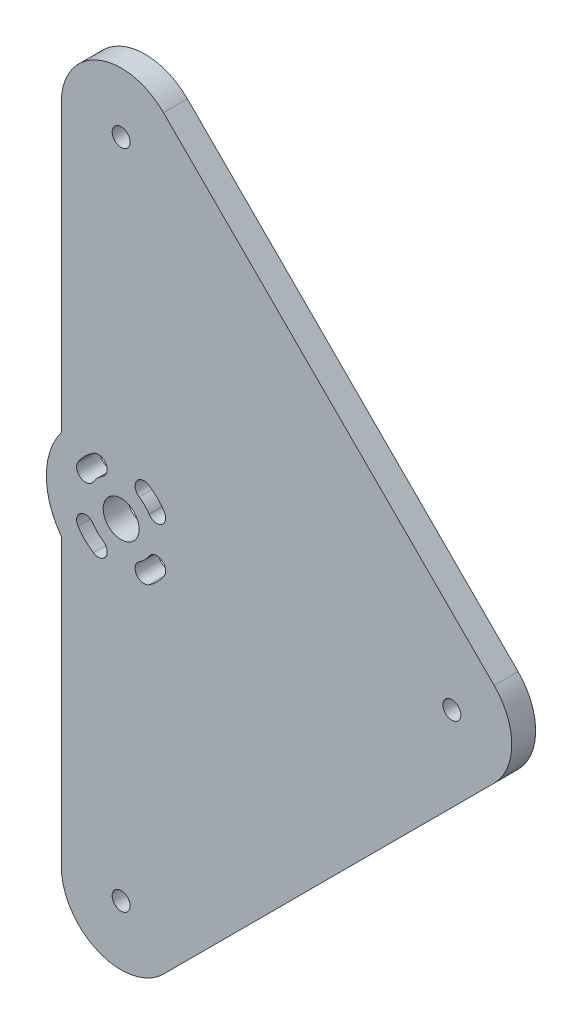
ISO-10303-21;
HEADER;
FILE_DESCRIPTION(('STEP AP214'),'2;1');
FILE_NAME('part.step','',(''),(''),'','','');
FILE_SCHEMA(('AUTOMOTIVE_DESIGN { 1 0 10303 214 1 1 1 1 }'));
ENDSEC;
DATA;
#1=APPLICATION_CONTEXT('core data for automotive mechanical design processes');
#2=APPLICATION_PROTOCOL_DEFINITION('international standard','automotive_design',2000,#1);
#3=PRODUCT_CONTEXT('',#1,'mechanical');
#4=PRODUCT('Part','Part','',(#3));
#5=PRODUCT_RELATED_PRODUCT_CATEGORY('part','',(#4));
#6=PRODUCT_DEFINITION_FORMATION('','',#4);
#7=PRODUCT_DEFINITION_CONTEXT('part definition',#1,'design');
#8=PRODUCT_DEFINITION('design','',#6,#7);
#9=PRODUCT_DEFINITION_SHAPE('','',#8);
#10=(LENGTH_UNIT() NAMED_UNIT(*) SI_UNIT(.MILLI.,.METRE.));
#11=(NAMED_UNIT(*) PLANE_ANGLE_UNIT() SI_UNIT($,.RADIAN.));
#12=(NAMED_UNIT(*) SI_UNIT($,.STERADIAN.) SOLID_ANGLE_UNIT());
#13=UNCERTAINTY_MEASURE_WITH_UNIT(LENGTH_MEASURE(1.E-05),#10,'distance_accuracy_value','');
#14=(GEOMETRIC_REPRESENTATION_CONTEXT(3) GLOBAL_UNCERTAINTY_ASSIGNED_CONTEXT((#13)) GLOBAL_UNIT_ASSIGNED_CONTEXT((#10,
#11,#12)) REPRESENTATION_CONTEXT('',''));
#15=CARTESIAN_POINT('',(0.,0.,0.));
#16=DIRECTION('',(0.,0.,1.));
#17=DIRECTION('',(1.,0.,0.));
#18=AXIS2_PLACEMENT_3D('',#15,#16,#17);
#19=CARTESIAN_POINT('',(1800.79736778428,1502.75717799725,4.));
#20=DIRECTION('',(0.,0.,1.));
#21=DIRECTION('',(1.,0.,0.));
#22=AXIS2_PLACEMENT_3D('',#19,#20,#21);
#23=PLANE('',#22);
#24=CARTESIAN_POINT('',(1856.05220178022,1558.01201199318,4.));
#25=DIRECTION('',(0.,0.,1.));
#26=DIRECTION('',(1.,0.,0.));
#27=AXIS2_PLACEMENT_3D('',#24,#25,#26);
#28=CIRCLE('',#27,1.50000000000006);
#29=CARTESIAN_POINT('',(1857.55220178022,1558.01201199318,4.));
#30=VERTEX_POINT('',#29);
#31=EDGE_CURVE('E331',#30,#30,#28,.T.);
#32=ORIENTED_EDGE('',*,*,#31,.F.);
#33=EDGE_LOOP('',(#32));
#34=FACE_BOUND('',#33,.T.);
#35=CARTESIAN_POINT('',(1800.79736778428,1558.01201199318,4.));
#36=DIRECTION('',(0.,0.,1.));
#37=DIRECTION('',(1.,0.,0.));
#38=AXIS2_PLACEMENT_3D('',#35,#36,#37);
#39=CIRCLE('',#38,2.99999999999989);
#40=CARTESIAN_POINT('',(1803.79736778428,1558.01201199318,4.));
#41=VERTEX_POINT('',#40);
#42=EDGE_CURVE('E343',#41,#41,#39,.T.);
#43=ORIENTED_EDGE('',*,*,#42,.F.);
#44=EDGE_LOOP('',(#43));
#45=FACE_BOUND('',#44,.T.);
#46=CARTESIAN_POINT('',(1800.79736778428,1502.75717799725,4.));
#47=DIRECTION('',(0.,0.,1.));
#48=DIRECTION('',(1.,0.,0.));
#49=AXIS2_PLACEMENT_3D('',#46,#47,#48);
#50=CIRCLE('',#49,10.);
#51=CARTESIAN_POINT('',(1790.79736778428,1502.75717799725,4.));
#52=VERTEX_POINT('',#51);
#53=CARTESIAN_POINT('',(1807.86843559615,1495.68611018538,4.));
#54=VERTEX_POINT('',#53);
#55=EDGE_CURVE('E349',#52,#54,#50,.T.);
#56=ORIENTED_EDGE('',*,*,#55,.T.);
#57=DIRECTION('',(0.70710678118655,0.707106781186545,0.));
#58=VECTOR('',#57,1.);
#59=CARTESIAN_POINT('',(1863.12326959209,1550.94094418132,4.));
#60=LINE('',#59,#58);
#61=CARTESIAN_POINT('',(1863.12326959209,1550.94094418132,4.));
#62=VERTEX_POINT('',#61);
#63=EDGE_CURVE('E352',#54,#62,#60,.T.);
#64=ORIENTED_EDGE('',*,*,#63,.T.);
#65=CARTESIAN_POINT('',(1856.05220178022,1558.01201199318,4.));
#66=DIRECTION('',(0.,0.,1.));
#67=DIRECTION('',(1.,0.,0.));
#68=AXIS2_PLACEMENT_3D('',#65,#66,#67);
#69=CIRCLE('',#68,10.);
#70=CARTESIAN_POINT('',(1863.12326959209,1565.08307980505,4.));
#71=VERTEX_POINT('',#70);
#72=EDGE_CURVE('E355',#62,#71,#69,.T.);
#73=ORIENTED_EDGE('',*,*,#72,.T.);
#74=DIRECTION('',(-0.707106781186546,0.707106781186549,0.));
#75=VECTOR('',#74,1.);
#76=CARTESIAN_POINT('',(1807.86843559615,1620.33791380099,4.));
#77=LINE('',#76,#75);
#78=CARTESIAN_POINT('',(1807.86843559615,1620.33791380099,4.));
#79=VERTEX_POINT('',#78);
#80=EDGE_CURVE('E357',#71,#79,#77,.T.);
#81=ORIENTED_EDGE('',*,*,#80,.T.);
#82=CARTESIAN_POINT('',(1800.79736778428,1613.26684598912,4.));
#83=DIRECTION('',(0.,0.,1.));
#84=DIRECTION('',(1.,0.,0.));
#85=AXIS2_PLACEMENT_3D('',#82,#83,#84);
#86=CIRCLE('',#85,10.0000000000001);
#87=CARTESIAN_POINT('',(1790.79736778428,1613.26684598912,4.));
#88=VERTEX_POINT('',#87);
#89=EDGE_CURVE('E359',#79,#88,#86,.T.);
#90=ORIENTED_EDGE('',*,*,#89,.T.);
#91=DIRECTION('',(0.,-1.,0.));
#92=VECTOR('',#91,1.);
#93=CARTESIAN_POINT('',(1790.79736778428,1613.26684598912,4.));
#94=LINE('',#93,#92);
#95=CARTESIAN_POINT('',(1790.79736778428,1565.51201199318,4.));
#96=VERTEX_POINT('',#95);
#97=EDGE_CURVE('E361',#88,#96,#94,.T.);
#98=ORIENTED_EDGE('',*,*,#97,.T.);
#99=CARTESIAN_POINT('',(1800.79736778428,1558.01201199318,4.));
#100=DIRECTION('',(0.,0.,1.));
#101=DIRECTION('',(1.,0.,0.));
#102=AXIS2_PLACEMENT_3D('',#99,#100,#101);
#103=CIRCLE('',#102,12.5);
#104=CARTESIAN_POINT('',(1790.79736778428,1550.51201199318,4.));
#105=VERTEX_POINT('',#104);
#106=EDGE_CURVE('E363',#96,#105,#103,.T.);
#107=ORIENTED_EDGE('',*,*,#106,.T.);
#108=DIRECTION('',(0.,-1.,0.));
#109=VECTOR('',#108,1.);
#110=CARTESIAN_POINT('',(1790.79736778428,1550.51201199318,4.));
#111=LINE('',#110,#109);
#112=EDGE_CURVE('E365',#105,#52,#111,.T.);
#113=ORIENTED_EDGE('',*,*,#112,.T.);
#114=EDGE_LOOP('',(#56,#64,#73,#81,#90,#98,#107,#113));
#115=FACE_BOUND('',#114,.T.);
#116=CARTESIAN_POINT('',(1800.79736778428,1613.26684598912,4.));
#117=DIRECTION('',(0.,0.,1.));
#118=DIRECTION('',(1.,0.,0.));
#119=AXIS2_PLACEMENT_3D('',#116,#117,#118);
#120=CIRCLE('',#119,1.50000000000006);
#121=CARTESIAN_POINT('',(1802.29736778428,1613.26684598912,4.));
#122=VERTEX_POINT('',#121);
#123=EDGE_CURVE('E337',#122,#122,#120,.T.);
#124=ORIENTED_EDGE('',*,*,#123,.F.);
#125=EDGE_LOOP('',(#124));
#126=FACE_BOUND('',#125,.T.);
#127=CARTESIAN_POINT('',(1800.79736778428,1502.75717799725,4.));
#128=DIRECTION('',(0.,0.,1.));
#129=DIRECTION('',(1.,0.,0.));
#130=AXIS2_PLACEMENT_3D('',#127,#128,#129);
#131=CIRCLE('',#130,1.50000000000006);
#132=CARTESIAN_POINT('',(1802.29736778428,1502.75717799725,4.));
#133=VERTEX_POINT('',#132);
#134=EDGE_CURVE('E325',#133,#133,#131,.T.);
#135=ORIENTED_EDGE('',*,*,#134,.F.);
#136=EDGE_LOOP('',(#135));
#137=FACE_BOUND('',#136,.T.);
#138=CARTESIAN_POINT('',(1800.79736778428,1558.01201199318,4.));
#139=DIRECTION('',(0.,0.,1.));
#140=DIRECTION('',(1.,0.,0.));
#141=AXIS2_PLACEMENT_3D('',#138,#139,#140);
#142=CIRCLE('',#141,8.57106781186541);
#143=CARTESIAN_POINT('',(1805.44325522365,1550.80930879672,4.));
#144=VERTEX_POINT('',#143);
#145=CARTESIAN_POINT('',(1808.00007098075,1553.36612455382,4.));
#146=VERTEX_POINT('',#145);
#147=EDGE_CURVE('E296',#144,#146,#142,.T.);
#148=ORIENTED_EDGE('',*,*,#147,.F.);
#149=CARTESIAN_POINT('',(1804.630190701,1552.0698349099,4.));
#150=DIRECTION('',(0.,0.,1.));
#151=DIRECTION('',(1.,0.,0.));
#152=AXIS2_PLACEMENT_3D('',#149,#150,#151);
#153=CIRCLE('',#152,1.49999999999997);
#154=CARTESIAN_POINT('',(1803.81712617835,1553.33036102308,4.));
#155=VERTEX_POINT('',#154);
#156=EDGE_CURVE('E294',#155,#144,#153,.T.);
#157=ORIENTED_EDGE('',*,*,#156,.F.);
#158=CARTESIAN_POINT('',(1800.79736778428,1558.01201199318,4.));
#159=DIRECTION('',(0.,0.,-1.));
#160=DIRECTION('',(1.,0.,0.));
#161=AXIS2_PLACEMENT_3D('',#158,#159,#160);
#162=CIRCLE('',#161,5.57106781186547);
#163=CARTESIAN_POINT('',(1805.47901875439,1554.99225359912,4.));
#164=VERTEX_POINT('',#163);
#165=EDGE_CURVE('E302',#164,#155,#162,.T.);
#166=ORIENTED_EDGE('',*,*,#165,.F.);
#167=CARTESIAN_POINT('',(1806.73954486757,1554.17918907647,4.));
#168=DIRECTION('',(0.,0.,1.));
#169=DIRECTION('',(1.,0.,0.));
#170=AXIS2_PLACEMENT_3D('',#167,#168,#169);
#171=CIRCLE('',#170,1.49999999999997);
#172=EDGE_CURVE('E299',#146,#164,#171,.T.);
#173=ORIENTED_EDGE('',*,*,#172,.F.);
#174=EDGE_LOOP('',(#148,#157,#166,#173));
#175=FACE_BOUND('',#174,.T.);
#176=CARTESIAN_POINT('',(1800.79736778428,1558.01201199318,4.));
#177=DIRECTION('',(0.,0.,1.));
#178=DIRECTION('',(1.,0.,0.));
#179=AXIS2_PLACEMENT_3D('',#176,#177,#178);
#180=CIRCLE('',#179,8.57106781186541);
#181=CARTESIAN_POINT('',(1808.00007098075,1562.65789943255,4.));
#182=VERTEX_POINT('',#181);
#183=CARTESIAN_POINT('',(1805.44325522365,1565.21471518965,4.));
#184=VERTEX_POINT('',#183);
#185=EDGE_CURVE('E265',#182,#184,#180,.T.);
#186=ORIENTED_EDGE('',*,*,#185,.F.);
#187=CARTESIAN_POINT('',(1806.73954486757,1561.8448349099,4.));
#188=DIRECTION('',(0.,0.,1.));
#189=DIRECTION('',(1.,0.,0.));
#190=AXIS2_PLACEMENT_3D('',#187,#188,#189);
#191=CIRCLE('',#190,1.49999999999997);
#192=CARTESIAN_POINT('',(1805.47901875439,1561.03177038725,4.));
#193=VERTEX_POINT('',#192);
#194=EDGE_CURVE('E263',#193,#182,#191,.T.);
#195=ORIENTED_EDGE('',*,*,#194,.F.);
#196=CARTESIAN_POINT('',(1800.79736778428,1558.01201199318,4.));
#197=DIRECTION('',(0.,0.,-1.));
#198=DIRECTION('',(1.,0.,0.));
#199=AXIS2_PLACEMENT_3D('',#196,#197,#198);
#200=CIRCLE('',#199,5.57106781186547);
#201=CARTESIAN_POINT('',(1803.81712617835,1562.69366296329,4.));
#202=VERTEX_POINT('',#201);
#203=EDGE_CURVE('E271',#202,#193,#200,.T.);
#204=ORIENTED_EDGE('',*,*,#203,.F.);
#205=CARTESIAN_POINT('',(1804.630190701,1563.95418907647,4.));
#206=DIRECTION('',(0.,0.,1.));
#207=DIRECTION('',(1.,0.,0.));
#208=AXIS2_PLACEMENT_3D('',#205,#206,#207);
#209=CIRCLE('',#208,1.49999999999997);
#210=EDGE_CURVE('E268',#184,#202,#209,.T.);
#211=ORIENTED_EDGE('',*,*,#210,.F.);
#212=EDGE_LOOP('',(#186,#195,#204,#211));
#213=FACE_BOUND('',#212,.T.);
#214=CARTESIAN_POINT('',(1800.79736778428,1558.01201199318,4.));
#215=DIRECTION('',(0.,0.,1.));
#216=DIRECTION('',(1.,0.,0.));
#217=AXIS2_PLACEMENT_3D('',#214,#215,#216);
#218=CIRCLE('',#217,8.57106781186556);
#219=CARTESIAN_POINT('',(1796.15148034492,1565.21471518965,4.));
#220=VERTEX_POINT('',#219);
#221=CARTESIAN_POINT('',(1793.59466458782,1562.65789943255,4.));
#222=VERTEX_POINT('',#221);
#223=EDGE_CURVE('E234',#220,#222,#218,.T.);
#224=ORIENTED_EDGE('',*,*,#223,.F.);
#225=CARTESIAN_POINT('',(1796.96454486757,1563.95418907647,4.));
#226=DIRECTION('',(0.,0.,1.));
#227=DIRECTION('',(1.,0.,0.));
#228=AXIS2_PLACEMENT_3D('',#225,#226,#227);
#229=CIRCLE('',#228,1.49999999999997);
#230=CARTESIAN_POINT('',(1797.77760939022,1562.69366296329,4.));
#231=VERTEX_POINT('',#230);
#232=EDGE_CURVE('E232',#231,#220,#229,.T.);
#233=ORIENTED_EDGE('',*,*,#232,.F.);
#234=CARTESIAN_POINT('',(1800.79736778428,1558.01201199318,4.));
#235=DIRECTION('',(0.,0.,-1.));
#236=DIRECTION('',(1.,0.,0.));
#237=AXIS2_PLACEMENT_3D('',#234,#235,#236);
#238=CIRCLE('',#237,5.57106781186563);
#239=CARTESIAN_POINT('',(1796.11571681418,1561.03177038725,4.));
#240=VERTEX_POINT('',#239);
#241=EDGE_CURVE('E240',#240,#231,#238,.T.);
#242=ORIENTED_EDGE('',*,*,#241,.F.);
#243=CARTESIAN_POINT('',(1794.855190701,1561.8448349099,4.));
#244=DIRECTION('',(0.,0.,1.));
#245=DIRECTION('',(1.,0.,0.));
#246=AXIS2_PLACEMENT_3D('',#243,#244,#245);
#247=CIRCLE('',#246,1.49999999999997);
#248=EDGE_CURVE('E237',#222,#240,#247,.T.);
#249=ORIENTED_EDGE('',*,*,#248,.F.);
#250=EDGE_LOOP('',(#224,#233,#242,#249));
#251=FACE_BOUND('',#250,.T.);
#252=CARTESIAN_POINT('',(1800.79736778428,1558.01201199318,4.));
#253=DIRECTION('',(0.,0.,1.));
#254=DIRECTION('',(1.,0.,0.));
#255=AXIS2_PLACEMENT_3D('',#252,#253,#254);
#256=CIRCLE('',#255,8.57106781186556);
#257=CARTESIAN_POINT('',(1793.59466458782,1553.36612455382,4.));
#258=VERTEX_POINT('',#257);
#259=CARTESIAN_POINT('',(1796.15148034492,1550.80930879672,4.));
#260=VERTEX_POINT('',#259);
#261=EDGE_CURVE('E204',#258,#260,#256,.T.);
#262=ORIENTED_EDGE('',*,*,#261,.F.);
#263=CARTESIAN_POINT('',(1794.855190701,1554.17918907647,4.));
#264=DIRECTION('',(0.,0.,1.));
#265=DIRECTION('',(1.,0.,0.));
#266=AXIS2_PLACEMENT_3D('',#263,#264,#265);
#267=CIRCLE('',#266,1.49999999999997);
#268=CARTESIAN_POINT('',(1796.11571681418,1554.99225359912,4.));
#269=VERTEX_POINT('',#268);
#270=EDGE_CURVE('E196',#269,#258,#267,.T.);
#271=ORIENTED_EDGE('',*,*,#270,.F.);
#272=CARTESIAN_POINT('',(1800.79736778428,1558.01201199318,4.));
#273=DIRECTION('',(0.,0.,-1.));
#274=DIRECTION('',(1.,0.,0.));
#275=AXIS2_PLACEMENT_3D('',#272,#273,#274);
#276=CIRCLE('',#275,5.57106781186563);
#277=CARTESIAN_POINT('',(1797.77760939022,1553.33036102308,4.));
#278=VERTEX_POINT('',#277);
#279=EDGE_CURVE('E218',#278,#269,#276,.T.);
#280=ORIENTED_EDGE('',*,*,#279,.F.);
#281=CARTESIAN_POINT('',(1796.96454486757,1552.0698349099,4.));
#282=DIRECTION('',(0.,0.,1.));
#283=DIRECTION('',(1.,0.,0.));
#284=AXIS2_PLACEMENT_3D('',#281,#282,#283);
#285=CIRCLE('',#284,1.49999999999997);
#286=EDGE_CURVE('E216',#260,#278,#285,.T.);
#287=ORIENTED_EDGE('',*,*,#286,.F.);
#288=EDGE_LOOP('',(#262,#271,#280,#287));
#289=FACE_BOUND('',#288,.T.);
#290=ADVANCED_FACE('F35',(#34,#45,#115,#126,#137,#175,#213,#251,#289),#23,.T.);
#291=CARTESIAN_POINT('',(1800.79736778428,1502.75717799725,0.));
#292=DIRECTION('',(0.,0.,1.));
#293=DIRECTION('',(1.,0.,0.));
#294=AXIS2_PLACEMENT_3D('',#291,#292,#293);
#295=PLANE('',#294);
#296=CARTESIAN_POINT('',(1796.96454486757,1563.95418907647,0.));
#297=DIRECTION('',(0.,0.,1.));
#298=DIRECTION('',(1.,0.,0.));
#299=AXIS2_PLACEMENT_3D('',#296,#297,#298);
#300=CIRCLE('',#299,1.49999999999997);
#301=CARTESIAN_POINT('',(1797.77760939022,1562.69366296329,0.));
#302=VERTEX_POINT('',#301);
#303=CARTESIAN_POINT('',(1796.15148034492,1565.21471518965,0.));
#304=VERTEX_POINT('',#303);
#305=EDGE_CURVE('E212',#302,#304,#300,.T.);
#306=ORIENTED_EDGE('',*,*,#305,.T.);
#307=CARTESIAN_POINT('',(1800.79736778428,1558.01201199318,0.));
#308=DIRECTION('',(0.,0.,1.));
#309=DIRECTION('',(1.,0.,0.));
#310=AXIS2_PLACEMENT_3D('',#307,#308,#309);
#311=CIRCLE('',#310,8.57106781186556);
#312=CARTESIAN_POINT('',(1793.59466458782,1562.65789943255,0.));
#313=VERTEX_POINT('',#312);
#314=EDGE_CURVE('E245',#304,#313,#311,.T.);
#315=ORIENTED_EDGE('',*,*,#314,.T.);
#316=CARTESIAN_POINT('',(1794.855190701,1561.8448349099,0.));
#317=DIRECTION('',(0.,0.,1.));
#318=DIRECTION('',(1.,0.,0.));
#319=AXIS2_PLACEMENT_3D('',#316,#317,#318);
#320=CIRCLE('',#319,1.49999999999997);
#321=CARTESIAN_POINT('',(1796.11571681418,1561.03177038725,0.));
#322=VERTEX_POINT('',#321);
#323=EDGE_CURVE('E248',#313,#322,#320,.T.);
#324=ORIENTED_EDGE('',*,*,#323,.T.);
#325=CARTESIAN_POINT('',(1800.79736778428,1558.01201199318,0.));
#326=DIRECTION('',(0.,0.,-1.));
#327=DIRECTION('',(1.,0.,0.));
#328=AXIS2_PLACEMENT_3D('',#325,#326,#327);
#329=CIRCLE('',#328,5.57106781186563);
#330=EDGE_CURVE('E235',#322,#302,#329,.T.);
#331=ORIENTED_EDGE('',*,*,#330,.T.);
#332=EDGE_LOOP('',(#306,#315,#324,#331));
#333=FACE_BOUND('',#332,.T.);
#334=CARTESIAN_POINT('',(1804.630190701,1552.0698349099,0.));
#335=DIRECTION('',(0.,0.,1.));
#336=DIRECTION('',(1.,0.,0.));
#337=AXIS2_PLACEMENT_3D('',#334,#335,#336);
#338=CIRCLE('',#337,1.49999999999997);
#339=CARTESIAN_POINT('',(1803.81712617835,1553.33036102308,0.));
#340=VERTEX_POINT('',#339);
#341=CARTESIAN_POINT('',(1805.44325522365,1550.80930879672,0.));
#342=VERTEX_POINT('',#341);
#343=EDGE_CURVE('E293',#340,#342,#338,.T.);
#344=ORIENTED_EDGE('',*,*,#343,.T.);
#345=CARTESIAN_POINT('',(1800.79736778428,1558.01201199318,0.));
#346=DIRECTION('',(0.,0.,1.));
#347=DIRECTION('',(1.,0.,0.));
#348=AXIS2_PLACEMENT_3D('',#345,#346,#347);
#349=CIRCLE('',#348,8.57106781186541);
#350=CARTESIAN_POINT('',(1808.00007098075,1553.36612455382,0.));
#351=VERTEX_POINT('',#350);
#352=EDGE_CURVE('E307',#342,#351,#349,.T.);
#353=ORIENTED_EDGE('',*,*,#352,.T.);
#354=CARTESIAN_POINT('',(1806.73954486757,1554.17918907647,0.));
#355=DIRECTION('',(0.,0.,1.));
#356=DIRECTION('',(1.,0.,0.));
#357=AXIS2_PLACEMENT_3D('',#354,#355,#356);
#358=CIRCLE('',#357,1.49999999999997);
#359=CARTESIAN_POINT('',(1805.47901875439,1554.99225359912,0.));
#360=VERTEX_POINT('',#359);
#361=EDGE_CURVE('E310',#351,#360,#358,.T.);
#362=ORIENTED_EDGE('',*,*,#361,.T.);
#363=CARTESIAN_POINT('',(1800.79736778428,1558.01201199318,0.));
#364=DIRECTION('',(0.,0.,-1.));
#365=DIRECTION('',(1.,0.,0.));
#366=AXIS2_PLACEMENT_3D('',#363,#364,#365);
#367=CIRCLE('',#366,5.57106781186547);
#368=EDGE_CURVE('E297',#360,#340,#367,.T.);
#369=ORIENTED_EDGE('',*,*,#368,.T.);
#370=EDGE_LOOP('',(#344,#353,#362,#369));
#371=FACE_BOUND('',#370,.T.);
#372=CARTESIAN_POINT('',(1800.79736778428,1502.75717799725,0.));
#373=DIRECTION('',(0.,0.,1.));
#374=DIRECTION('',(1.,0.,0.));
#375=AXIS2_PLACEMENT_3D('',#372,#373,#374);
#376=CIRCLE('',#375,10.);
#377=CARTESIAN_POINT('',(1790.79736778428,1502.75717799725,0.));
#378=VERTEX_POINT('',#377);
#379=CARTESIAN_POINT('',(1807.86843559615,1495.68611018538,0.));
#380=VERTEX_POINT('',#379);
#381=EDGE_CURVE('E346',#378,#380,#376,.T.);
#382=ORIENTED_EDGE('',*,*,#381,.F.);
#383=DIRECTION('',(0.,-1.,0.));
#384=VECTOR('',#383,1.);
#385=CARTESIAN_POINT('',(1790.79736778428,1550.51201199318,0.));
#386=LINE('',#385,#384);
#387=CARTESIAN_POINT('',(1790.79736778428,1550.51201199318,0.));
#388=VERTEX_POINT('',#387);
#389=EDGE_CURVE('E353',#388,#378,#386,.T.);
#390=ORIENTED_EDGE('',*,*,#389,.F.);
#391=CARTESIAN_POINT('',(1800.79736778428,1558.01201199318,0.));
#392=DIRECTION('',(0.,0.,1.));
#393=DIRECTION('',(1.,0.,0.));
#394=AXIS2_PLACEMENT_3D('',#391,#392,#393);
#395=CIRCLE('',#394,12.5);
#396=CARTESIAN_POINT('',(1790.79736778428,1565.51201199318,0.));
#397=VERTEX_POINT('',#396);
#398=EDGE_CURVE('E380',#397,#388,#395,.T.);
#399=ORIENTED_EDGE('',*,*,#398,.F.);
#400=DIRECTION('',(0.,-1.,0.));
#401=VECTOR('',#400,1.);
#402=CARTESIAN_POINT('',(1790.79736778428,1613.26684598912,0.));
#403=LINE('',#402,#401);
#404=CARTESIAN_POINT('',(1790.79736778428,1613.26684598912,0.));
#405=VERTEX_POINT('',#404);
#406=EDGE_CURVE('E378',#405,#397,#403,.T.);
#407=ORIENTED_EDGE('',*,*,#406,.F.);
#408=CARTESIAN_POINT('',(1800.79736778428,1613.26684598912,0.));
#409=DIRECTION('',(0.,0.,1.));
#410=DIRECTION('',(1.,0.,0.));
#411=AXIS2_PLACEMENT_3D('',#408,#409,#410);
#412=CIRCLE('',#411,10.0000000000001);
#413=CARTESIAN_POINT('',(1807.86843559615,1620.33791380099,0.));
#414=VERTEX_POINT('',#413);
#415=EDGE_CURVE('E376',#414,#405,#412,.T.);
#416=ORIENTED_EDGE('',*,*,#415,.F.);
#417=DIRECTION('',(-0.707106781186546,0.707106781186549,0.));
#418=VECTOR('',#417,1.);
#419=CARTESIAN_POINT('',(1807.86843559615,1620.33791380099,0.));
#420=LINE('',#419,#418);
#421=CARTESIAN_POINT('',(1863.12326959209,1565.08307980505,0.));
#422=VERTEX_POINT('',#421);
#423=EDGE_CURVE('E374',#422,#414,#420,.T.);
#424=ORIENTED_EDGE('',*,*,#423,.F.);
#425=CARTESIAN_POINT('',(1856.05220178022,1558.01201199318,0.));
#426=DIRECTION('',(0.,0.,1.));
#427=DIRECTION('',(1.,0.,0.));
#428=AXIS2_PLACEMENT_3D('',#425,#426,#427);
#429=CIRCLE('',#428,10.);
#430=CARTESIAN_POINT('',(1863.12326959209,1550.94094418132,0.));
#431=VERTEX_POINT('',#430);
#432=EDGE_CURVE('E372',#431,#422,#429,.T.);
#433=ORIENTED_EDGE('',*,*,#432,.F.);
#434=DIRECTION('',(0.70710678118655,0.707106781186545,0.));
#435=VECTOR('',#434,1.);
#436=CARTESIAN_POINT('',(1863.12326959209,1550.94094418132,0.));
#437=LINE('',#436,#435);
#438=EDGE_CURVE('E370',#380,#431,#437,.T.);
#439=ORIENTED_EDGE('',*,*,#438,.F.);
#440=EDGE_LOOP('',(#382,#390,#399,#407,#416,#424,#433,#439));
#441=FACE_BOUND('',#440,.T.);
#442=CARTESIAN_POINT('',(1800.79736778428,1558.01201199318,0.));
#443=DIRECTION('',(0.,0.,1.));
#444=DIRECTION('',(1.,0.,0.));
#445=AXIS2_PLACEMENT_3D('',#442,#443,#444);
#446=CIRCLE('',#445,2.99999999999989);
#447=CARTESIAN_POINT('',(1803.79736778428,1558.01201199318,0.));
#448=VERTEX_POINT('',#447);
#449=EDGE_CURVE('E340',#448,#448,#446,.T.);
#450=ORIENTED_EDGE('',*,*,#449,.T.);
#451=EDGE_LOOP('',(#450));
#452=FACE_BOUND('',#451,.T.);
#453=CARTESIAN_POINT('',(1800.79736778428,1613.26684598912,0.));
#454=DIRECTION('',(0.,0.,1.));
#455=DIRECTION('',(1.,0.,0.));
#456=AXIS2_PLACEMENT_3D('',#453,#454,#455);
#457=CIRCLE('',#456,1.50000000000006);
#458=CARTESIAN_POINT('',(1802.29736778428,1613.26684598912,0.));
#459=VERTEX_POINT('',#458);
#460=EDGE_CURVE('E334',#459,#459,#457,.T.);
#461=ORIENTED_EDGE('',*,*,#460,.T.);
#462=EDGE_LOOP('',(#461));
#463=FACE_BOUND('',#462,.T.);
#464=CARTESIAN_POINT('',(1856.05220178022,1558.01201199318,0.));
#465=DIRECTION('',(0.,0.,1.));
#466=DIRECTION('',(1.,0.,0.));
#467=AXIS2_PLACEMENT_3D('',#464,#465,#466);
#468=CIRCLE('',#467,1.50000000000006);
#469=CARTESIAN_POINT('',(1857.55220178022,1558.01201199318,0.));
#470=VERTEX_POINT('',#469);
#471=EDGE_CURVE('E328',#470,#470,#468,.T.);
#472=ORIENTED_EDGE('',*,*,#471,.T.);
#473=EDGE_LOOP('',(#472));
#474=FACE_BOUND('',#473,.T.);
#475=CARTESIAN_POINT('',(1800.79736778428,1502.75717799725,0.));
#476=DIRECTION('',(0.,0.,1.));
#477=DIRECTION('',(1.,0.,0.));
#478=AXIS2_PLACEMENT_3D('',#475,#476,#477);
#479=CIRCLE('',#478,1.50000000000006);
#480=CARTESIAN_POINT('',(1802.29736778428,1502.75717799725,0.));
#481=VERTEX_POINT('',#480);
#482=EDGE_CURVE('E324',#481,#481,#479,.T.);
#483=ORIENTED_EDGE('',*,*,#482,.T.);
#484=EDGE_LOOP('',(#483));
#485=FACE_BOUND('',#484,.T.);
#486=CARTESIAN_POINT('',(1806.73954486757,1561.8448349099,0.));
#487=DIRECTION('',(0.,0.,1.));
#488=DIRECTION('',(1.,0.,0.));
#489=AXIS2_PLACEMENT_3D('',#486,#487,#488);
#490=CIRCLE('',#489,1.49999999999997);
#491=CARTESIAN_POINT('',(1805.47901875439,1561.03177038725,0.));
#492=VERTEX_POINT('',#491);
#493=CARTESIAN_POINT('',(1808.00007098075,1562.65789943255,0.));
#494=VERTEX_POINT('',#493);
#495=EDGE_CURVE('E262',#492,#494,#490,.T.);
#496=ORIENTED_EDGE('',*,*,#495,.T.);
#497=CARTESIAN_POINT('',(1800.79736778428,1558.01201199318,0.));
#498=DIRECTION('',(0.,0.,1.));
#499=DIRECTION('',(1.,0.,0.));
#500=AXIS2_PLACEMENT_3D('',#497,#498,#499);
#501=CIRCLE('',#500,8.57106781186541);
#502=CARTESIAN_POINT('',(1805.44325522365,1565.21471518965,0.));
#503=VERTEX_POINT('',#502);
#504=EDGE_CURVE('E276',#494,#503,#501,.T.);
#505=ORIENTED_EDGE('',*,*,#504,.T.);
#506=CARTESIAN_POINT('',(1804.630190701,1563.95418907647,0.));
#507=DIRECTION('',(0.,0.,1.));
#508=DIRECTION('',(1.,0.,0.));
#509=AXIS2_PLACEMENT_3D('',#506,#507,#508);
#510=CIRCLE('',#509,1.49999999999997);
#511=CARTESIAN_POINT('',(1803.81712617835,1562.69366296329,0.));
#512=VERTEX_POINT('',#511);
#513=EDGE_CURVE('E279',#503,#512,#510,.T.);
#514=ORIENTED_EDGE('',*,*,#513,.T.);
#515=CARTESIAN_POINT('',(1800.79736778428,1558.01201199318,0.));
#516=DIRECTION('',(0.,0.,-1.));
#517=DIRECTION('',(1.,0.,0.));
#518=AXIS2_PLACEMENT_3D('',#515,#516,#517);
#519=CIRCLE('',#518,5.57106781186547);
#520=EDGE_CURVE('E266',#512,#492,#519,.T.);
#521=ORIENTED_EDGE('',*,*,#520,.T.);
#522=EDGE_LOOP('',(#496,#505,#514,#521));
#523=FACE_BOUND('',#522,.T.);
#524=CARTESIAN_POINT('',(1794.855190701,1554.17918907647,0.));
#525=DIRECTION('',(0.,0.,1.));
#526=DIRECTION('',(1.,0.,0.));
#527=AXIS2_PLACEMENT_3D('',#524,#525,#526);
#528=CIRCLE('',#527,1.49999999999997);
#529=CARTESIAN_POINT('',(1796.11571681418,1554.99225359912,0.));
#530=VERTEX_POINT('',#529);
#531=CARTESIAN_POINT('',(1793.59466458782,1553.36612455382,0.));
#532=VERTEX_POINT('',#531);
#533=EDGE_CURVE('E58',#530,#532,#528,.T.);
#534=ORIENTED_EDGE('',*,*,#533,.T.);
#535=CARTESIAN_POINT('',(1800.79736778428,1558.01201199318,0.));
#536=DIRECTION('',(0.,0.,1.));
#537=DIRECTION('',(1.,0.,0.));
#538=AXIS2_PLACEMENT_3D('',#535,#536,#537);
#539=CIRCLE('',#538,8.57106781186556);
#540=CARTESIAN_POINT('',(1796.15148034492,1550.80930879672,0.));
#541=VERTEX_POINT('',#540);
#542=EDGE_CURVE('E211',#532,#541,#539,.T.);
#543=ORIENTED_EDGE('',*,*,#542,.T.);
#544=CARTESIAN_POINT('',(1796.96454486757,1552.0698349099,0.));
#545=DIRECTION('',(0.,0.,1.));
#546=DIRECTION('',(1.,0.,0.));
#547=AXIS2_PLACEMENT_3D('',#544,#545,#546);
#548=CIRCLE('',#547,1.49999999999997);
#549=CARTESIAN_POINT('',(1797.77760939022,1553.33036102308,0.));
#550=VERTEX_POINT('',#549);
#551=EDGE_CURVE('E224',#541,#550,#548,.T.);
#552=ORIENTED_EDGE('',*,*,#551,.T.);
#553=CARTESIAN_POINT('',(1800.79736778428,1558.01201199318,0.));
#554=DIRECTION('',(0.,0.,-1.));
#555=DIRECTION('',(1.,0.,0.));
#556=AXIS2_PLACEMENT_3D('',#553,#554,#555);
#557=CIRCLE('',#556,5.57106781186563);
#558=EDGE_CURVE('E205',#550,#530,#557,.T.);
#559=ORIENTED_EDGE('',*,*,#558,.T.);
#560=EDGE_LOOP('',(#534,#543,#552,#559));
#561=FACE_BOUND('',#560,.T.);
#562=ADVANCED_FACE('F410',(#333,#371,#441,#452,#463,#474,#485,#523,#561),#295,.F.);
#563=CARTESIAN_POINT('',(1800.79736778428,1502.75717799725,4.));
#564=DIRECTION('',(0.,0.,-1.));
#565=DIRECTION('',(-1.,0.,0.));
#566=AXIS2_PLACEMENT_3D('',#563,#564,#565);
#567=CYLINDRICAL_SURFACE('',#566,10.);
#568=ORIENTED_EDGE('',*,*,#381,.T.);
#569=DIRECTION('',(0.,0.,-1.));
#570=VECTOR('',#569,1.);
#571=CARTESIAN_POINT('',(1807.86843559615,1495.68611018538,4.));
#572=LINE('',#571,#570);
#573=EDGE_CURVE('E11',#54,#380,#572,.T.);
#574=ORIENTED_EDGE('',*,*,#573,.F.);
#575=ORIENTED_EDGE('',*,*,#55,.F.);
#576=DIRECTION('',(0.,0.,-1.));
#577=VECTOR('',#576,1.);
#578=CARTESIAN_POINT('',(1790.79736778428,1502.75717799725,4.));
#579=LINE('',#578,#577);
#580=EDGE_CURVE('E367',#52,#378,#579,.T.);
#581=ORIENTED_EDGE('',*,*,#580,.T.);
#582=EDGE_LOOP('',(#568,#574,#575,#581));
#583=FACE_BOUND('',#582,.T.);
#584=ADVANCED_FACE('F37',(#583),#567,.T.);
#585=CARTESIAN_POINT('',(1863.12326959209,1550.94094418132,4.));
#586=DIRECTION('',(-0.707106781186545,0.70710678118655,0.));
#587=DIRECTION('',(-0.70710678118655,-0.707106781186545,0.));
#588=AXIS2_PLACEMENT_3D('',#585,#586,#587);
#589=PLANE('',#588);
#590=ORIENTED_EDGE('',*,*,#438,.T.);
#591=DIRECTION('',(0.,0.,-1.));
#592=VECTOR('',#591,1.);
#593=CARTESIAN_POINT('',(1863.12326959209,1550.94094418132,4.));
#594=LINE('',#593,#592);
#595=EDGE_CURVE('E43',#62,#431,#594,.T.);
#596=ORIENTED_EDGE('',*,*,#595,.F.);
#597=ORIENTED_EDGE('',*,*,#63,.F.);
#598=ORIENTED_EDGE('',*,*,#573,.T.);
#599=EDGE_LOOP('',(#590,#596,#597,#598));
#600=FACE_BOUND('',#599,.T.);
#601=ADVANCED_FACE('F428',(#600),#589,.F.);
#602=CARTESIAN_POINT('',(1856.05220178022,1558.01201199318,4.));
#603=DIRECTION('',(0.,0.,-1.));
#604=DIRECTION('',(-1.,0.,0.));
#605=AXIS2_PLACEMENT_3D('',#602,#603,#604);
#606=CYLINDRICAL_SURFACE('',#605,10.);
#607=ORIENTED_EDGE('',*,*,#432,.T.);
#608=DIRECTION('',(0.,0.,-1.));
#609=VECTOR('',#608,1.);
#610=CARTESIAN_POINT('',(1863.12326959209,1565.08307980505,4.));
#611=LINE('',#610,#609);
#612=EDGE_CURVE('E397',#71,#422,#611,.T.);
#613=ORIENTED_EDGE('',*,*,#612,.F.);
#614=ORIENTED_EDGE('',*,*,#72,.F.);
#615=ORIENTED_EDGE('',*,*,#595,.T.);
#616=EDGE_LOOP('',(#607,#613,#614,#615));
#617=FACE_BOUND('',#616,.T.);
#618=ADVANCED_FACE('F404',(#617),#606,.T.);
#619=CARTESIAN_POINT('',(1807.86843559615,1620.33791380099,4.));
#620=DIRECTION('',(-0.707106781186549,-0.707106781186546,0.));
#621=DIRECTION('',(0.707106781186546,-0.707106781186549,0.));
#622=AXIS2_PLACEMENT_3D('',#619,#620,#621);
#623=PLANE('',#622);
#624=ORIENTED_EDGE('',*,*,#423,.T.);
#625=DIRECTION('',(0.,0.,-1.));
#626=VECTOR('',#625,1.);
#627=CARTESIAN_POINT('',(1807.86843559615,1620.33791380099,4.));
#628=LINE('',#627,#626);
#629=EDGE_CURVE('E394',#79,#414,#628,.T.);
#630=ORIENTED_EDGE('',*,*,#629,.F.);
#631=ORIENTED_EDGE('',*,*,#80,.F.);
#632=ORIENTED_EDGE('',*,*,#612,.T.);
#633=EDGE_LOOP('',(#624,#630,#631,#632));
#634=FACE_BOUND('',#633,.T.);
#635=ADVANCED_FACE('F416',(#634),#623,.F.);
#636=CARTESIAN_POINT('',(1800.79736778428,1613.26684598912,4.));
#637=DIRECTION('',(0.,0.,-1.));
#638=DIRECTION('',(-1.,0.,0.));
#639=AXIS2_PLACEMENT_3D('',#636,#637,#638);
#640=CYLINDRICAL_SURFACE('',#639,10.0000000000001);
#641=ORIENTED_EDGE('',*,*,#415,.T.);
#642=DIRECTION('',(0.,0.,-1.));
#643=VECTOR('',#642,1.);
#644=CARTESIAN_POINT('',(1790.79736778428,1613.26684598912,4.));
#645=LINE('',#644,#643);
#646=EDGE_CURVE('E391',#88,#405,#645,.T.);
#647=ORIENTED_EDGE('',*,*,#646,.F.);
#648=ORIENTED_EDGE('',*,*,#89,.F.);
#649=ORIENTED_EDGE('',*,*,#629,.T.);
#650=EDGE_LOOP('',(#641,#647,#648,#649));
#651=FACE_BOUND('',#650,.T.);
#652=ADVANCED_FACE('F420',(#651),#640,.T.);
#653=CARTESIAN_POINT('',(1790.79736778428,1613.26684598912,4.));
#654=DIRECTION('',(1.,0.,0.));
#655=DIRECTION('',(0.,1.,0.));
#656=AXIS2_PLACEMENT_3D('',#653,#654,#655);
#657=PLANE('',#656);
#658=ORIENTED_EDGE('',*,*,#406,.T.);
#659=DIRECTION('',(0.,0.,-1.));
#660=VECTOR('',#659,1.);
#661=CARTESIAN_POINT('',(1790.79736778428,1565.51201199318,4.));
#662=LINE('',#661,#660);
#663=EDGE_CURVE('E388',#96,#397,#662,.T.);
#664=ORIENTED_EDGE('',*,*,#663,.F.);
#665=ORIENTED_EDGE('',*,*,#97,.F.);
#666=ORIENTED_EDGE('',*,*,#646,.T.);
#667=EDGE_LOOP('',(#658,#664,#665,#666));
#668=FACE_BOUND('',#667,.T.);
#669=ADVANCED_FACE('F441',(#668),#657,.F.);
#670=CARTESIAN_POINT('',(1800.79736778428,1558.01201199318,4.));
#671=DIRECTION('',(0.,0.,-1.));
#672=DIRECTION('',(-1.,0.,0.));
#673=AXIS2_PLACEMENT_3D('',#670,#671,#672);
#674=CYLINDRICAL_SURFACE('',#673,12.5);
#675=ORIENTED_EDGE('',*,*,#398,.T.);
#676=DIRECTION('',(0.,0.,-1.));
#677=VECTOR('',#676,1.);
#678=CARTESIAN_POINT('',(1790.79736778428,1550.51201199318,4.));
#679=LINE('',#678,#677);
#680=EDGE_CURVE('E385',#105,#388,#679,.T.);
#681=ORIENTED_EDGE('',*,*,#680,.F.);
#682=ORIENTED_EDGE('',*,*,#106,.F.);
#683=ORIENTED_EDGE('',*,*,#663,.T.);
#684=EDGE_LOOP('',(#675,#681,#682,#683));
#685=FACE_BOUND('',#684,.T.);
#686=ADVANCED_FACE('F439',(#685),#674,.T.);
#687=CARTESIAN_POINT('',(1790.79736778428,1550.51201199318,4.));
#688=DIRECTION('',(1.,0.,0.));
#689=DIRECTION('',(0.,1.,0.));
#690=AXIS2_PLACEMENT_3D('',#687,#688,#689);
#691=PLANE('',#690);
#692=ORIENTED_EDGE('',*,*,#389,.T.);
#693=ORIENTED_EDGE('',*,*,#580,.F.);
#694=ORIENTED_EDGE('',*,*,#112,.F.);
#695=ORIENTED_EDGE('',*,*,#680,.T.);
#696=EDGE_LOOP('',(#692,#693,#694,#695));
#697=FACE_BOUND('',#696,.T.);
#698=ADVANCED_FACE('F434',(#697),#691,.F.);
#699=CARTESIAN_POINT('',(1800.79736778428,1558.01201199318,4.));
#700=DIRECTION('',(0.,0.,-1.));
#701=DIRECTION('',(-1.,0.,0.));
#702=AXIS2_PLACEMENT_3D('',#699,#700,#701);
#703=CYLINDRICAL_SURFACE('',#702,2.99999999999989);
#704=ORIENTED_EDGE('',*,*,#42,.T.);
#705=EDGE_LOOP('',(#704));
#706=FACE_BOUND('',#705,.T.);
#707=ORIENTED_EDGE('',*,*,#449,.F.);
#708=EDGE_LOOP('',(#707));
#709=FACE_BOUND('',#708,.T.);
#710=ADVANCED_FACE('F461',(#706,#709),#703,.F.);
#711=CARTESIAN_POINT('',(1800.79736778428,1613.26684598912,4.));
#712=DIRECTION('',(0.,0.,-1.));
#713=DIRECTION('',(-1.,0.,0.));
#714=AXIS2_PLACEMENT_3D('',#711,#712,#713);
#715=CYLINDRICAL_SURFACE('',#714,1.50000000000006);
#716=ORIENTED_EDGE('',*,*,#123,.T.);
#717=EDGE_LOOP('',(#716));
#718=FACE_BOUND('',#717,.T.);
#719=ORIENTED_EDGE('',*,*,#460,.F.);
#720=EDGE_LOOP('',(#719));
#721=FACE_BOUND('',#720,.T.);
#722=ADVANCED_FACE('F468',(#718,#721),#715,.F.);
#723=CARTESIAN_POINT('',(1856.05220178022,1558.01201199318,4.));
#724=DIRECTION('',(0.,0.,-1.));
#725=DIRECTION('',(-1.,0.,0.));
#726=AXIS2_PLACEMENT_3D('',#723,#724,#725);
#727=CYLINDRICAL_SURFACE('',#726,1.50000000000006);
#728=ORIENTED_EDGE('',*,*,#31,.T.);
#729=EDGE_LOOP('',(#728));
#730=FACE_BOUND('',#729,.T.);
#731=ORIENTED_EDGE('',*,*,#471,.F.);
#732=EDGE_LOOP('',(#731));
#733=FACE_BOUND('',#732,.T.);
#734=ADVANCED_FACE('F473',(#730,#733),#727,.F.);
#735=CARTESIAN_POINT('',(1800.79736778428,1502.75717799725,4.));
#736=DIRECTION('',(0.,0.,-1.));
#737=DIRECTION('',(-1.,0.,0.));
#738=AXIS2_PLACEMENT_3D('',#735,#736,#737);
#739=CYLINDRICAL_SURFACE('',#738,1.50000000000006);
#740=ORIENTED_EDGE('',*,*,#134,.T.);
#741=EDGE_LOOP('',(#740));
#742=FACE_BOUND('',#741,.T.);
#743=ORIENTED_EDGE('',*,*,#482,.F.);
#744=EDGE_LOOP('',(#743));
#745=FACE_BOUND('',#744,.T.);
#746=ADVANCED_FACE('F548',(#742,#745),#739,.F.);
#747=CARTESIAN_POINT('',(1804.630190701,1552.0698349099,4.));
#748=DIRECTION('',(0.,0.,-1.));
#749=DIRECTION('',(-1.,0.,0.));
#750=AXIS2_PLACEMENT_3D('',#747,#748,#749);
#751=CYLINDRICAL_SURFACE('',#750,1.49999999999997);
#752=ORIENTED_EDGE('',*,*,#343,.F.);
#753=DIRECTION('',(0.,0.,-1.));
#754=VECTOR('',#753,1.);
#755=CARTESIAN_POINT('',(1803.81712617835,1553.33036102308,4.));
#756=LINE('',#755,#754);
#757=EDGE_CURVE('E304',#155,#340,#756,.T.);
#758=ORIENTED_EDGE('',*,*,#757,.F.);
#759=ORIENTED_EDGE('',*,*,#156,.T.);
#760=DIRECTION('',(0.,0.,-1.));
#761=VECTOR('',#760,1.);
#762=CARTESIAN_POINT('',(1805.44325522365,1550.80930879672,4.));
#763=LINE('',#762,#761);
#764=EDGE_CURVE('E321',#144,#342,#763,.T.);
#765=ORIENTED_EDGE('',*,*,#764,.T.);
#766=EDGE_LOOP('',(#752,#758,#759,#765));
#767=FACE_BOUND('',#766,.T.);
#768=ADVANCED_FACE('F544',(#767),#751,.F.);
#769=CARTESIAN_POINT('',(1800.79736778428,1558.01201199318,4.));
#770=DIRECTION('',(0.,0.,-1.));
#771=DIRECTION('',(-1.,0.,0.));
#772=AXIS2_PLACEMENT_3D('',#769,#770,#771);
#773=CYLINDRICAL_SURFACE('',#772,8.57106781186541);
#774=ORIENTED_EDGE('',*,*,#352,.F.);
#775=ORIENTED_EDGE('',*,*,#764,.F.);
#776=ORIENTED_EDGE('',*,*,#147,.T.);
#777=DIRECTION('',(0.,0.,-1.));
#778=VECTOR('',#777,1.);
#779=CARTESIAN_POINT('',(1808.00007098075,1553.36612455382,4.));
#780=LINE('',#779,#778);
#781=EDGE_CURVE('E319',#146,#351,#780,.T.);
#782=ORIENTED_EDGE('',*,*,#781,.T.);
#783=EDGE_LOOP('',(#774,#775,#776,#782));
#784=FACE_BOUND('',#783,.T.);
#785=ADVANCED_FACE('F540',(#784),#773,.F.);
#786=CARTESIAN_POINT('',(1806.73954486757,1554.17918907647,4.));
#787=DIRECTION('',(0.,0.,-1.));
#788=DIRECTION('',(-1.,0.,0.));
#789=AXIS2_PLACEMENT_3D('',#786,#787,#788);
#790=CYLINDRICAL_SURFACE('',#789,1.49999999999997);
#791=ORIENTED_EDGE('',*,*,#361,.F.);
#792=ORIENTED_EDGE('',*,*,#781,.F.);
#793=ORIENTED_EDGE('',*,*,#172,.T.);
#794=DIRECTION('',(0.,0.,-1.));
#795=VECTOR('',#794,1.);
#796=CARTESIAN_POINT('',(1805.47901875439,1554.99225359912,4.));
#797=LINE('',#796,#795);
#798=EDGE_CURVE('E317',#164,#360,#797,.T.);
#799=ORIENTED_EDGE('',*,*,#798,.T.);
#800=EDGE_LOOP('',(#791,#792,#793,#799));
#801=FACE_BOUND('',#800,.T.);
#802=ADVANCED_FACE('F536',(#801),#790,.F.);
#803=CARTESIAN_POINT('',(1800.79736778428,1558.01201199318,4.));
#804=DIRECTION('',(0.,0.,-1.));
#805=DIRECTION('',(-1.,0.,0.));
#806=AXIS2_PLACEMENT_3D('',#803,#804,#805);
#807=CYLINDRICAL_SURFACE('',#806,5.57106781186547);
#808=ORIENTED_EDGE('',*,*,#368,.F.);
#809=ORIENTED_EDGE('',*,*,#798,.F.);
#810=ORIENTED_EDGE('',*,*,#165,.T.);
#811=ORIENTED_EDGE('',*,*,#757,.T.);
#812=EDGE_LOOP('',(#808,#809,#810,#811));
#813=FACE_BOUND('',#812,.T.);
#814=ADVANCED_FACE('F532',(#813),#807,.T.);
#815=CARTESIAN_POINT('',(1806.73954486757,1561.8448349099,4.));
#816=DIRECTION('',(0.,0.,-1.));
#817=DIRECTION('',(-1.,0.,0.));
#818=AXIS2_PLACEMENT_3D('',#815,#816,#817);
#819=CYLINDRICAL_SURFACE('',#818,1.49999999999997);
#820=ORIENTED_EDGE('',*,*,#495,.F.);
#821=DIRECTION('',(0.,0.,-1.));
#822=VECTOR('',#821,1.);
#823=CARTESIAN_POINT('',(1805.47901875439,1561.03177038725,4.));
#824=LINE('',#823,#822);
#825=EDGE_CURVE('E273',#193,#492,#824,.T.);
#826=ORIENTED_EDGE('',*,*,#825,.F.);
#827=ORIENTED_EDGE('',*,*,#194,.T.);
#828=DIRECTION('',(0.,0.,-1.));
#829=VECTOR('',#828,1.);
#830=CARTESIAN_POINT('',(1808.00007098075,1562.65789943255,4.));
#831=LINE('',#830,#829);
#832=EDGE_CURVE('E290',#182,#494,#831,.T.);
#833=ORIENTED_EDGE('',*,*,#832,.T.);
#834=EDGE_LOOP('',(#820,#826,#827,#833));
#835=FACE_BOUND('',#834,.T.);
#836=ADVANCED_FACE('F528',(#835),#819,.F.);
#837=CARTESIAN_POINT('',(1800.79736778428,1558.01201199318,4.));
#838=DIRECTION('',(0.,0.,-1.));
#839=DIRECTION('',(-1.,0.,0.));
#840=AXIS2_PLACEMENT_3D('',#837,#838,#839);
#841=CYLINDRICAL_SURFACE('',#840,8.57106781186541);
#842=ORIENTED_EDGE('',*,*,#504,.F.);
#843=ORIENTED_EDGE('',*,*,#832,.F.);
#844=ORIENTED_EDGE('',*,*,#185,.T.);
#845=DIRECTION('',(0.,0.,-1.));
#846=VECTOR('',#845,1.);
#847=CARTESIAN_POINT('',(1805.44325522365,1565.21471518965,4.));
#848=LINE('',#847,#846);
#849=EDGE_CURVE('E288',#184,#503,#848,.T.);
#850=ORIENTED_EDGE('',*,*,#849,.T.);
#851=EDGE_LOOP('',(#842,#843,#844,#850));
#852=FACE_BOUND('',#851,.T.);
#853=ADVANCED_FACE('F524',(#852),#841,.F.);
#854=CARTESIAN_POINT('',(1804.630190701,1563.95418907647,4.));
#855=DIRECTION('',(0.,0.,-1.));
#856=DIRECTION('',(-1.,0.,0.));
#857=AXIS2_PLACEMENT_3D('',#854,#855,#856);
#858=CYLINDRICAL_SURFACE('',#857,1.49999999999997);
#859=ORIENTED_EDGE('',*,*,#513,.F.);
#860=ORIENTED_EDGE('',*,*,#849,.F.);
#861=ORIENTED_EDGE('',*,*,#210,.T.);
#862=DIRECTION('',(0.,0.,-1.));
#863=VECTOR('',#862,1.);
#864=CARTESIAN_POINT('',(1803.81712617835,1562.69366296329,4.));
#865=LINE('',#864,#863);
#866=EDGE_CURVE('E286',#202,#512,#865,.T.);
#867=ORIENTED_EDGE('',*,*,#866,.T.);
#868=EDGE_LOOP('',(#859,#860,#861,#867));
#869=FACE_BOUND('',#868,.T.);
#870=ADVANCED_FACE('F520',(#869),#858,.F.);
#871=CARTESIAN_POINT('',(1800.79736778428,1558.01201199318,4.));
#872=DIRECTION('',(0.,0.,-1.));
#873=DIRECTION('',(-1.,0.,0.));
#874=AXIS2_PLACEMENT_3D('',#871,#872,#873);
#875=CYLINDRICAL_SURFACE('',#874,5.57106781186547);
#876=ORIENTED_EDGE('',*,*,#520,.F.);
#877=ORIENTED_EDGE('',*,*,#866,.F.);
#878=ORIENTED_EDGE('',*,*,#203,.T.);
#879=ORIENTED_EDGE('',*,*,#825,.T.);
#880=EDGE_LOOP('',(#876,#877,#878,#879));
#881=FACE_BOUND('',#880,.T.);
#882=ADVANCED_FACE('F516',(#881),#875,.T.);
#883=CARTESIAN_POINT('',(1796.96454486757,1563.95418907647,4.));
#884=DIRECTION('',(0.,0.,-1.));
#885=DIRECTION('',(-1.,0.,0.));
#886=AXIS2_PLACEMENT_3D('',#883,#884,#885);
#887=CYLINDRICAL_SURFACE('',#886,1.49999999999997);
#888=ORIENTED_EDGE('',*,*,#305,.F.);
#889=DIRECTION('',(0.,0.,-1.));
#890=VECTOR('',#889,1.);
#891=CARTESIAN_POINT('',(1797.77760939022,1562.69366296329,4.));
#892=LINE('',#891,#890);
#893=EDGE_CURVE('E242',#231,#302,#892,.T.);
#894=ORIENTED_EDGE('',*,*,#893,.F.);
#895=ORIENTED_EDGE('',*,*,#232,.T.);
#896=DIRECTION('',(0.,0.,-1.));
#897=VECTOR('',#896,1.);
#898=CARTESIAN_POINT('',(1796.15148034492,1565.21471518965,4.));
#899=LINE('',#898,#897);
#900=EDGE_CURVE('E259',#220,#304,#899,.T.);
#901=ORIENTED_EDGE('',*,*,#900,.T.);
#902=EDGE_LOOP('',(#888,#894,#895,#901));
#903=FACE_BOUND('',#902,.T.);
#904=ADVANCED_FACE('F512',(#903),#887,.F.);
#905=CARTESIAN_POINT('',(1800.79736778428,1558.01201199318,4.));
#906=DIRECTION('',(0.,0.,-1.));
#907=DIRECTION('',(-1.,0.,0.));
#908=AXIS2_PLACEMENT_3D('',#905,#906,#907);
#909=CYLINDRICAL_SURFACE('',#908,8.57106781186556);
#910=ORIENTED_EDGE('',*,*,#314,.F.);
#911=ORIENTED_EDGE('',*,*,#900,.F.);
#912=ORIENTED_EDGE('',*,*,#223,.T.);
#913=DIRECTION('',(0.,0.,-1.));
#914=VECTOR('',#913,1.);
#915=CARTESIAN_POINT('',(1793.59466458782,1562.65789943255,4.));
#916=LINE('',#915,#914);
#917=EDGE_CURVE('E257',#222,#313,#916,.T.);
#918=ORIENTED_EDGE('',*,*,#917,.T.);
#919=EDGE_LOOP('',(#910,#911,#912,#918));
#920=FACE_BOUND('',#919,.T.);
#921=ADVANCED_FACE('F508',(#920),#909,.F.);
#922=CARTESIAN_POINT('',(1794.855190701,1561.8448349099,4.));
#923=DIRECTION('',(0.,0.,-1.));
#924=DIRECTION('',(-1.,0.,0.));
#925=AXIS2_PLACEMENT_3D('',#922,#923,#924);
#926=CYLINDRICAL_SURFACE('',#925,1.49999999999997);
#927=ORIENTED_EDGE('',*,*,#323,.F.);
#928=ORIENTED_EDGE('',*,*,#917,.F.);
#929=ORIENTED_EDGE('',*,*,#248,.T.);
#930=DIRECTION('',(0.,0.,-1.));
#931=VECTOR('',#930,1.);
#932=CARTESIAN_POINT('',(1796.11571681418,1561.03177038725,4.));
#933=LINE('',#932,#931);
#934=EDGE_CURVE('E255',#240,#322,#933,.T.);
#935=ORIENTED_EDGE('',*,*,#934,.T.);
#936=EDGE_LOOP('',(#927,#928,#929,#935));
#937=FACE_BOUND('',#936,.T.);
#938=ADVANCED_FACE('F504',(#937),#926,.F.);
#939=CARTESIAN_POINT('',(1800.79736778428,1558.01201199318,4.));
#940=DIRECTION('',(0.,0.,-1.));
#941=DIRECTION('',(-1.,0.,0.));
#942=AXIS2_PLACEMENT_3D('',#939,#940,#941);
#943=CYLINDRICAL_SURFACE('',#942,5.57106781186563);
#944=ORIENTED_EDGE('',*,*,#330,.F.);
#945=ORIENTED_EDGE('',*,*,#934,.F.);
#946=ORIENTED_EDGE('',*,*,#241,.T.);
#947=ORIENTED_EDGE('',*,*,#893,.T.);
#948=EDGE_LOOP('',(#944,#945,#946,#947));
#949=FACE_BOUND('',#948,.T.);
#950=ADVANCED_FACE('F501',(#949),#943,.T.);
#951=CARTESIAN_POINT('',(1794.855190701,1554.17918907647,4.));
#952=DIRECTION('',(0.,0.,-1.));
#953=DIRECTION('',(-1.,0.,0.));
#954=AXIS2_PLACEMENT_3D('',#951,#952,#953);
#955=CYLINDRICAL_SURFACE('',#954,1.49999999999997);
#956=ORIENTED_EDGE('',*,*,#533,.F.);
#957=DIRECTION('',(0.,0.,-1.));
#958=VECTOR('',#957,1.);
#959=CARTESIAN_POINT('',(1796.11571681418,1554.99225359912,4.));
#960=LINE('',#959,#958);
#961=EDGE_CURVE('E200',#269,#530,#960,.T.);
#962=ORIENTED_EDGE('',*,*,#961,.F.);
#963=ORIENTED_EDGE('',*,*,#270,.T.);
#964=DIRECTION('',(0.,0.,-1.));
#965=VECTOR('',#964,1.);
#966=CARTESIAN_POINT('',(1793.59466458782,1553.36612455382,4.));
#967=LINE('',#966,#965);
#968=EDGE_CURVE('E199',#258,#532,#967,.T.);
#969=ORIENTED_EDGE('',*,*,#968,.T.);
#970=EDGE_LOOP('',(#956,#962,#963,#969));
#971=FACE_BOUND('',#970,.T.);
#972=ADVANCED_FACE('F198',(#971),#955,.F.);
#973=CARTESIAN_POINT('',(1800.79736778428,1558.01201199318,4.));
#974=DIRECTION('',(0.,0.,-1.));
#975=DIRECTION('',(-1.,0.,0.));
#976=AXIS2_PLACEMENT_3D('',#973,#974,#975);
#977=CYLINDRICAL_SURFACE('',#976,8.57106781186556);
#978=ORIENTED_EDGE('',*,*,#542,.F.);
#979=ORIENTED_EDGE('',*,*,#968,.F.);
#980=ORIENTED_EDGE('',*,*,#261,.T.);
#981=DIRECTION('',(0.,0.,-1.));
#982=VECTOR('',#981,1.);
#983=CARTESIAN_POINT('',(1796.15148034492,1550.80930879672,4.));
#984=LINE('',#983,#982);
#985=EDGE_CURVE('E213',#260,#541,#984,.T.);
#986=ORIENTED_EDGE('',*,*,#985,.T.);
#987=EDGE_LOOP('',(#978,#979,#980,#986));
#988=FACE_BOUND('',#987,.T.);
#989=ADVANCED_FACE('F208',(#988),#977,.F.);
#990=CARTESIAN_POINT('',(1796.96454486757,1552.0698349099,4.));
#991=DIRECTION('',(0.,0.,-1.));
#992=DIRECTION('',(-1.,0.,0.));
#993=AXIS2_PLACEMENT_3D('',#990,#991,#992);
#994=CYLINDRICAL_SURFACE('',#993,1.49999999999997);
#995=ORIENTED_EDGE('',*,*,#551,.F.);
#996=ORIENTED_EDGE('',*,*,#985,.F.);
#997=ORIENTED_EDGE('',*,*,#286,.T.);
#998=DIRECTION('',(0.,0.,-1.));
#999=VECTOR('',#998,1.);
#1000=CARTESIAN_POINT('',(1797.77760939022,1553.33036102308,4.));
#1001=LINE('',#1000,#999);
#1002=EDGE_CURVE('E50',#278,#550,#1001,.T.);
#1003=ORIENTED_EDGE('',*,*,#1002,.T.);
#1004=EDGE_LOOP('',(#995,#996,#997,#1003));
#1005=FACE_BOUND('',#1004,.T.);
#1006=ADVANCED_FACE('F489',(#1005),#994,.F.);
#1007=CARTESIAN_POINT('',(1800.79736778428,1558.01201199318,4.));
#1008=DIRECTION('',(0.,0.,-1.));
#1009=DIRECTION('',(-1.,0.,0.));
#1010=AXIS2_PLACEMENT_3D('',#1007,#1008,#1009);
#1011=CYLINDRICAL_SURFACE('',#1010,5.57106781186563);
#1012=ORIENTED_EDGE('',*,*,#558,.F.);
#1013=ORIENTED_EDGE('',*,*,#1002,.F.);
#1014=ORIENTED_EDGE('',*,*,#279,.T.);
#1015=ORIENTED_EDGE('',*,*,#961,.T.);
#1016=EDGE_LOOP('',(#1012,#1013,#1014,#1015));
#1017=FACE_BOUND('',#1016,.T.);
#1018=ADVANCED_FACE('F487',(#1017),#1011,.T.);
#1019=CLOSED_SHELL('',(#290,#562,#584,#601,#618,#635,#652,#669,#686,#698,#710,#722,#734,#746,
#768,#785,#802,#814,#836,#853,#870,#882,#904,#921,#938,#950,#972,#989,#1006,#1018));
#1020=MANIFOLD_SOLID_BREP('B2',#1019);
#1021=ADVANCED_BREP_SHAPE_REPRESENTATION('',(#18,#1020),#14);
#1022=SHAPE_DEFINITION_REPRESENTATION(#9,#1021);
ENDSEC;
END-ISO-10303-21;
